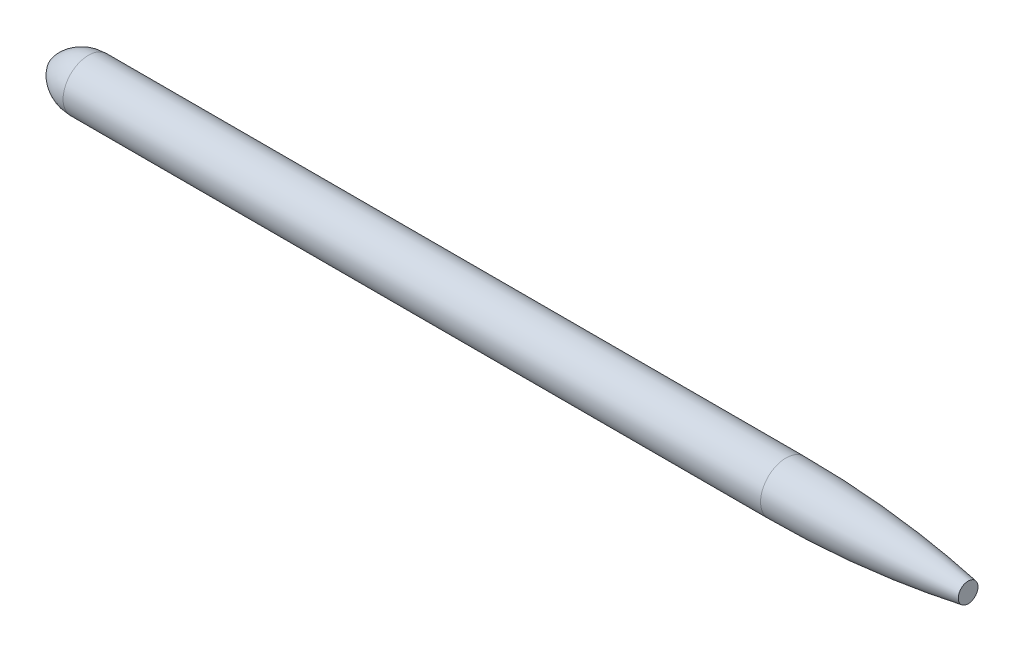
ISO-10303-21;
HEADER;
FILE_DESCRIPTION(('STEP AP214'),'2;1');
FILE_NAME('part.step','',(''),(''),'','','');
FILE_SCHEMA(('AUTOMOTIVE_DESIGN { 1 0 10303 214 1 1 1 1 }'));
ENDSEC;
DATA;
#1=APPLICATION_CONTEXT('core data for automotive mechanical design processes');
#2=APPLICATION_PROTOCOL_DEFINITION('international standard','automotive_design',2000,#1);
#3=PRODUCT_CONTEXT('',#1,'mechanical');
#4=PRODUCT('Part','Part','',(#3));
#5=PRODUCT_RELATED_PRODUCT_CATEGORY('part','',(#4));
#6=PRODUCT_DEFINITION_FORMATION('','',#4);
#7=PRODUCT_DEFINITION_CONTEXT('part definition',#1,'design');
#8=PRODUCT_DEFINITION('design','',#6,#7);
#9=PRODUCT_DEFINITION_SHAPE('','',#8);
#10=(LENGTH_UNIT() NAMED_UNIT(*) SI_UNIT(.MILLI.,.METRE.));
#11=(NAMED_UNIT(*) PLANE_ANGLE_UNIT() SI_UNIT($,.RADIAN.));
#12=(NAMED_UNIT(*) SI_UNIT($,.STERADIAN.) SOLID_ANGLE_UNIT());
#13=UNCERTAINTY_MEASURE_WITH_UNIT(LENGTH_MEASURE(1.E-05),#10,'distance_accuracy_value','');
#14=(GEOMETRIC_REPRESENTATION_CONTEXT(3) GLOBAL_UNCERTAINTY_ASSIGNED_CONTEXT((#13)) GLOBAL_UNIT_ASSIGNED_CONTEXT((#10,
#11,#12)) REPRESENTATION_CONTEXT('',''));
#15=CARTESIAN_POINT('',(0.,0.,0.));
#16=DIRECTION('',(0.,0.,1.));
#17=DIRECTION('',(1.,0.,0.));
#18=AXIS2_PLACEMENT_3D('',#15,#16,#17);
#19=CARTESIAN_POINT('',(270.,0.,-112.5));
#20=DIRECTION('',(0.,-1.,0.));
#21=DIRECTION('',(0.,0.,1.));
#22=AXIS2_PLACEMENT_3D('',#19,#20,#21);
#23=CIRCLE('',#22,292.5);
#24=TRIMMED_CURVE('',#23,(PARAMETER_VALUE(-1.17600520709513)),
(PARAMETER_VALUE(1.17600520709513)),.T.,.PARAMETER.);
#25=CARTESIAN_POINT('',(270.,0.,0.));
#26=DIRECTION('',(-1.,0.,0.));
#27=AXIS1_PLACEMENT('',#25,#26);
#28=SURFACE_OF_REVOLUTION('',#24,#27);
#29=CARTESIAN_POINT('',(270.,0.,0.));
#30=DIRECTION('',(-1.,0.,0.));
#31=DIRECTION('',(0.,0.,1.));
#32=AXIS2_PLACEMENT_3D('',#29,#30,#31);
#33=CIRCLE('',#32,180.);
#34=CARTESIAN_POINT('',(270.,0.,180.));
#35=VERTEX_POINT('',#34);
#36=EDGE_CURVE('E54',#35,#35,#33,.T.);
#37=ORIENTED_EDGE('',*,*,#36,.T.);
#38=EDGE_LOOP('',(#37));
#39=FACE_BOUND('',#38,.T.);
#40=CARTESIAN_POINT('',(0.,0.,0.));
#41=VERTEX_POINT('',#40);
#42=VERTEX_LOOP('',#41);
#43=FACE_BOUND('',#42,.T.);
#44=ADVANCED_FACE('F35',(#39,#43),#28,.T.);
#45=CARTESIAN_POINT('',(6500.,0.,70.));
#46=DIRECTION('',(1.,0.,0.));
#47=DIRECTION('',(0.,0.,-1.));
#48=AXIS2_PLACEMENT_3D('',#45,#46,#47);
#49=PLANE('',#48);
#50=CARTESIAN_POINT('',(6500.,0.,0.));
#51=DIRECTION('',(-1.,0.,0.));
#52=DIRECTION('',(0.,0.,1.));
#53=AXIS2_PLACEMENT_3D('',#50,#51,#52);
#54=CIRCLE('',#53,70.);
#55=CARTESIAN_POINT('',(6500.,0.,70.));
#56=VERTEX_POINT('',#55);
#57=EDGE_CURVE('E11',#56,#56,#54,.T.);
#58=ORIENTED_EDGE('',*,*,#57,.F.);
#59=EDGE_LOOP('',(#58));
#60=FACE_BOUND('',#59,.T.);
#61=ADVANCED_FACE('F45',(#60),#49,.T.);
#62=CARTESIAN_POINT('',(5210.,0.,0.));
#63=DIRECTION('',(-1.,0.,0.));
#64=DIRECTION('',(0.,0.,1.));
#65=AXIS2_PLACEMENT_3D('',#62,#63,#64);
#66=DEGENERATE_TOROIDAL_SURFACE('',#65,7439.0909090909,7619.0909090909,.F.);
#67=ORIENTED_EDGE('',*,*,#57,.T.);
#68=EDGE_LOOP('',(#67));
#69=FACE_BOUND('',#68,.T.);
#70=CARTESIAN_POINT('',(5210.,0.,0.));
#71=DIRECTION('',(-1.,0.,0.));
#72=DIRECTION('',(0.,0.,1.));
#73=AXIS2_PLACEMENT_3D('',#70,#71,#72);
#74=CIRCLE('',#73,180.);
#75=CARTESIAN_POINT('',(5210.,0.,180.));
#76=VERTEX_POINT('',#75);
#77=EDGE_CURVE('E41',#76,#76,#74,.T.);
#78=ORIENTED_EDGE('',*,*,#77,.F.);
#79=EDGE_LOOP('',(#78));
#80=FACE_BOUND('',#79,.T.);
#81=ADVANCED_FACE('F50',(#69,#80),#66,.F.);
#82=CARTESIAN_POINT('',(0.,0.,0.));
#83=DIRECTION('',(-1.,0.,0.));
#84=DIRECTION('',(0.,0.,1.));
#85=AXIS2_PLACEMENT_3D('',#82,#83,#84);
#86=CYLINDRICAL_SURFACE('',#85,180.);
#87=ORIENTED_EDGE('',*,*,#77,.T.);
#88=EDGE_LOOP('',(#87));
#89=FACE_BOUND('',#88,.T.);
#90=ORIENTED_EDGE('',*,*,#36,.F.);
#91=EDGE_LOOP('',(#90));
#92=FACE_BOUND('',#91,.T.);
#93=ADVANCED_FACE('F60',(#89,#92),#86,.T.);
#94=CLOSED_SHELL('',(#44,#61,#81,#93));
#95=MANIFOLD_SOLID_BREP('B2',#94);
#96=ADVANCED_BREP_SHAPE_REPRESENTATION('',(#18,#95),#14);
#97=SHAPE_DEFINITION_REPRESENTATION(#9,#96);
ENDSEC;
END-ISO-10303-21;
